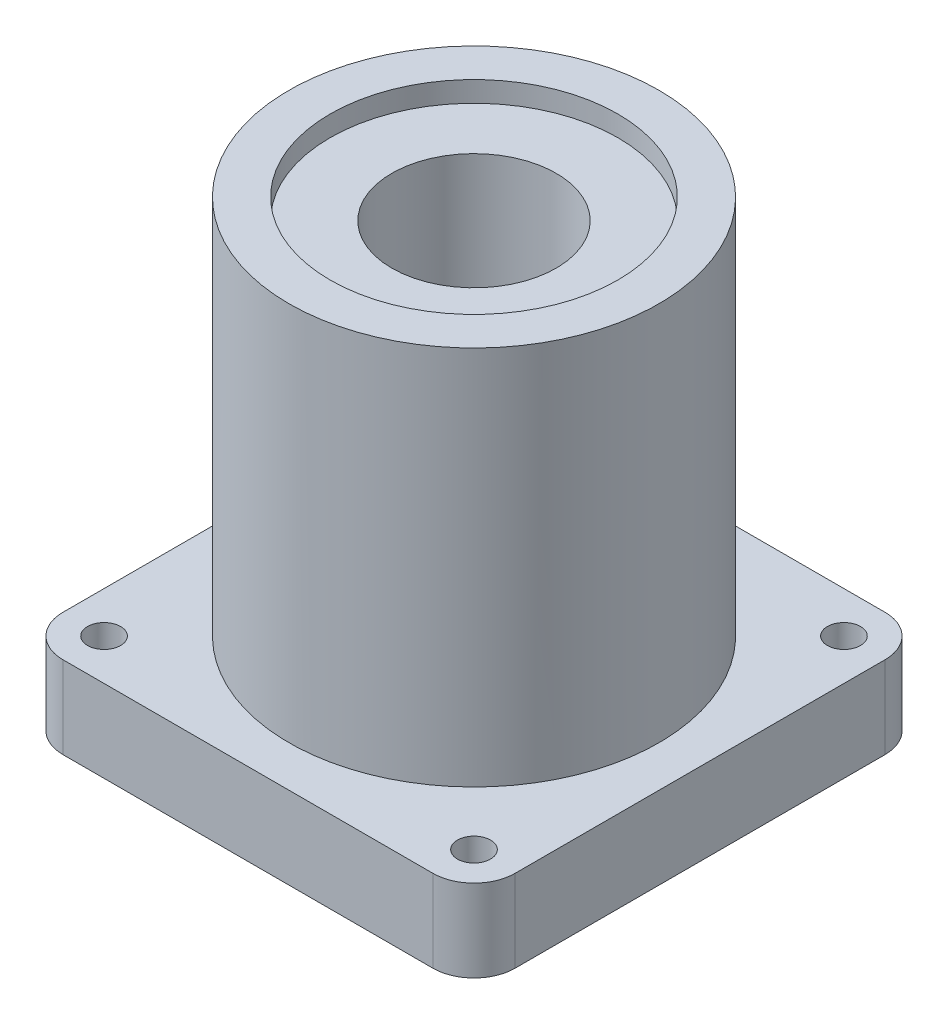
ISO-10303-21;
HEADER;
FILE_DESCRIPTION(('STEP AP214'),'2;1');
FILE_NAME('part.step','',(''),(''),'','','');
FILE_SCHEMA(('AUTOMOTIVE_DESIGN { 1 0 10303 214 1 1 1 1 }'));
ENDSEC;
DATA;
#1=APPLICATION_CONTEXT('core data for automotive mechanical design processes');
#2=APPLICATION_PROTOCOL_DEFINITION('international standard','automotive_design',2000,#1);
#3=PRODUCT_CONTEXT('',#1,'mechanical');
#4=PRODUCT('Part','Part','',(#3));
#5=PRODUCT_RELATED_PRODUCT_CATEGORY('part','',(#4));
#6=PRODUCT_DEFINITION_FORMATION('','',#4);
#7=PRODUCT_DEFINITION_CONTEXT('part definition',#1,'design');
#8=PRODUCT_DEFINITION('design','',#6,#7);
#9=PRODUCT_DEFINITION_SHAPE('','',#8);
#10=(LENGTH_UNIT() NAMED_UNIT(*) SI_UNIT(.MILLI.,.METRE.));
#11=(NAMED_UNIT(*) PLANE_ANGLE_UNIT() SI_UNIT($,.RADIAN.));
#12=(NAMED_UNIT(*) SI_UNIT($,.STERADIAN.) SOLID_ANGLE_UNIT());
#13=UNCERTAINTY_MEASURE_WITH_UNIT(LENGTH_MEASURE(1.E-05),#10,'distance_accuracy_value','');
#14=(GEOMETRIC_REPRESENTATION_CONTEXT(3) GLOBAL_UNCERTAINTY_ASSIGNED_CONTEXT((#13)) GLOBAL_UNIT_ASSIGNED_CONTEXT((#10,
#11,#12)) REPRESENTATION_CONTEXT('',''));
#15=CARTESIAN_POINT('',(0.,0.,0.));
#16=DIRECTION('',(0.,0.,1.));
#17=DIRECTION('',(1.,0.,0.));
#18=AXIS2_PLACEMENT_3D('',#15,#16,#17);
#19=CARTESIAN_POINT('',(-34.925,12.7,34.925));
#20=DIRECTION('',(0.,-1.,0.));
#21=DIRECTION('',(0.,0.,-1.));
#22=AXIS2_PLACEMENT_3D('',#19,#20,#21);
#23=PLANE('',#22);
#24=CARTESIAN_POINT('',(28.5750000000002,12.7,28.5749999999998));
#25=DIRECTION('',(0.,1.,0.));
#26=DIRECTION('',(0.,0.,1.));
#27=AXIS2_PLACEMENT_3D('',#24,#25,#26);
#28=CIRCLE('',#27,2.55269999999999);
#29=CARTESIAN_POINT('',(28.5750000000002,12.7,31.1276999999998));
#30=VERTEX_POINT('',#29);
#31=EDGE_CURVE('E259',#30,#30,#28,.T.);
#32=ORIENTED_EDGE('',*,*,#31,.F.);
#33=EDGE_LOOP('',(#32));
#34=FACE_BOUND('',#33,.T.);
#35=CARTESIAN_POINT('',(-28.5749999999999,12.7,28.5750000000001));
#36=DIRECTION('',(0.,1.,0.));
#37=DIRECTION('',(0.,0.,1.));
#38=AXIS2_PLACEMENT_3D('',#35,#36,#37);
#39=CIRCLE('',#38,2.55269999999999);
#40=CARTESIAN_POINT('',(-28.5749999999999,12.7,31.1277000000001));
#41=VERTEX_POINT('',#40);
#42=EDGE_CURVE('E255',#41,#41,#39,.T.);
#43=ORIENTED_EDGE('',*,*,#42,.F.);
#44=EDGE_LOOP('',(#43));
#45=FACE_BOUND('',#44,.T.);
#46=CARTESIAN_POINT('',(-28.575,12.7,-28.575));
#47=DIRECTION('',(0.,1.,0.));
#48=DIRECTION('',(0.,0.,1.));
#49=AXIS2_PLACEMENT_3D('',#46,#47,#48);
#50=CIRCLE('',#49,2.55269999999999);
#51=CARTESIAN_POINT('',(-28.575,12.7,-26.0223));
#52=VERTEX_POINT('',#51);
#53=EDGE_CURVE('E252',#52,#52,#50,.T.);
#54=ORIENTED_EDGE('',*,*,#53,.F.);
#55=EDGE_LOOP('',(#54));
#56=FACE_BOUND('',#55,.T.);
#57=DIRECTION('',(1.,0.,0.));
#58=VECTOR('',#57,1.);
#59=CARTESIAN_POINT('',(-34.925,12.7,34.925));
#60=LINE('',#59,#58);
#61=CARTESIAN_POINT('',(-28.575,12.7,34.925));
#62=VERTEX_POINT('',#61);
#63=CARTESIAN_POINT('',(28.575,12.7,34.925));
#64=VERTEX_POINT('',#63);
#65=EDGE_CURVE('E130',#62,#64,#60,.T.);
#66=ORIENTED_EDGE('',*,*,#65,.T.);
#67=CARTESIAN_POINT('',(28.575,12.7,28.575));
#68=DIRECTION('',(0.,-1.,0.));
#69=DIRECTION('',(0.,0.,-1.));
#70=AXIS2_PLACEMENT_3D('',#67,#68,#69);
#71=CIRCLE('',#70,6.35);
#72=CARTESIAN_POINT('',(34.925,12.7,28.575));
#73=VERTEX_POINT('',#72);
#74=EDGE_CURVE('E149',#64,#73,#71,.F.);
#75=ORIENTED_EDGE('',*,*,#74,.T.);
#76=DIRECTION('',(0.,0.,1.));
#77=VECTOR('',#76,1.);
#78=CARTESIAN_POINT('',(34.925,12.7,-34.925));
#79=LINE('',#78,#77);
#80=CARTESIAN_POINT('',(34.925,12.7,-28.575));
#81=VERTEX_POINT('',#80);
#82=EDGE_CURVE('E181',#81,#73,#79,.T.);
#83=ORIENTED_EDGE('',*,*,#82,.F.);
#84=CARTESIAN_POINT('',(28.575,12.7,-28.575));
#85=DIRECTION('',(0.,-1.,0.));
#86=DIRECTION('',(0.,0.,-1.));
#87=AXIS2_PLACEMENT_3D('',#84,#85,#86);
#88=CIRCLE('',#87,6.35);
#89=CARTESIAN_POINT('',(28.575,12.7,-34.925));
#90=VERTEX_POINT('',#89);
#91=EDGE_CURVE('E59',#81,#90,#88,.F.);
#92=ORIENTED_EDGE('',*,*,#91,.T.);
#93=DIRECTION('',(-1.,0.,0.));
#94=VECTOR('',#93,1.);
#95=CARTESIAN_POINT('',(34.925,12.7,-34.925));
#96=LINE('',#95,#94);
#97=CARTESIAN_POINT('',(-28.575,12.7,-34.925));
#98=VERTEX_POINT('',#97);
#99=EDGE_CURVE('E179',#90,#98,#96,.T.);
#100=ORIENTED_EDGE('',*,*,#99,.T.);
#101=CARTESIAN_POINT('',(-28.575,12.7,-28.575));
#102=DIRECTION('',(0.,-1.,0.));
#103=DIRECTION('',(0.,0.,-1.));
#104=AXIS2_PLACEMENT_3D('',#101,#102,#103);
#105=CIRCLE('',#104,6.35);
#106=CARTESIAN_POINT('',(-34.925,12.7,-28.575));
#107=VERTEX_POINT('',#106);
#108=EDGE_CURVE('E144',#98,#107,#105,.F.);
#109=ORIENTED_EDGE('',*,*,#108,.T.);
#110=DIRECTION('',(0.,0.,-1.));
#111=VECTOR('',#110,1.);
#112=CARTESIAN_POINT('',(-34.925,12.7,34.925));
#113=LINE('',#112,#111);
#114=CARTESIAN_POINT('',(-34.925,12.7,28.575));
#115=VERTEX_POINT('',#114);
#116=EDGE_CURVE('E164',#115,#107,#113,.T.);
#117=ORIENTED_EDGE('',*,*,#116,.F.);
#118=CARTESIAN_POINT('',(-28.575,12.7,28.575));
#119=DIRECTION('',(0.,-1.,0.));
#120=DIRECTION('',(0.,0.,-1.));
#121=AXIS2_PLACEMENT_3D('',#118,#119,#120);
#122=CIRCLE('',#121,6.35);
#123=EDGE_CURVE('E146',#115,#62,#122,.F.);
#124=ORIENTED_EDGE('',*,*,#123,.T.);
#125=EDGE_LOOP('',(#66,#75,#83,#92,#100,#109,#117,#124));
#126=FACE_BOUND('',#125,.T.);
#127=CARTESIAN_POINT('',(0.,12.7,0.));
#128=DIRECTION('',(0.,-1.,0.));
#129=DIRECTION('',(0.,0.,-1.));
#130=AXIS2_PLACEMENT_3D('',#127,#128,#129);
#131=CIRCLE('',#130,28.575);
#132=CARTESIAN_POINT('',(0.,12.7,-28.575));
#133=VERTEX_POINT('',#132);
#134=EDGE_CURVE('E125',#133,#133,#131,.F.);
#135=ORIENTED_EDGE('',*,*,#134,.F.);
#136=EDGE_LOOP('',(#135));
#137=FACE_BOUND('',#136,.T.);
#138=CARTESIAN_POINT('',(28.5749999999997,12.7,-28.5750000000003));
#139=DIRECTION('',(0.,1.,0.));
#140=DIRECTION('',(0.,0.,1.));
#141=AXIS2_PLACEMENT_3D('',#138,#139,#140);
#142=CIRCLE('',#141,2.55269999999999);
#143=CARTESIAN_POINT('',(28.5749999999997,12.7,-26.0223000000003));
#144=VERTEX_POINT('',#143);
#145=EDGE_CURVE('E263',#144,#144,#142,.T.);
#146=ORIENTED_EDGE('',*,*,#145,.F.);
#147=EDGE_LOOP('',(#146));
#148=FACE_BOUND('',#147,.T.);
#149=ADVANCED_FACE('F36',(#34,#45,#56,#126,#137,#148),#23,.F.);
#150=CARTESIAN_POINT('',(0.,0.,0.));
#151=DIRECTION('',(0.,1.,0.));
#152=DIRECTION('',(0.,0.,1.));
#153=AXIS2_PLACEMENT_3D('',#150,#151,#152);
#154=CYLINDRICAL_SURFACE('',#153,12.7);
#155=CARTESIAN_POINT('',(0.,0.,0.));
#156=DIRECTION('',(0.,1.,0.));
#157=DIRECTION('',(0.,0.,1.));
#158=AXIS2_PLACEMENT_3D('',#155,#156,#157);
#159=CIRCLE('',#158,12.7);
#160=CARTESIAN_POINT('',(0.,0.,12.7));
#161=VERTEX_POINT('',#160);
#162=EDGE_CURVE('E172',#161,#161,#159,.T.);
#163=ORIENTED_EDGE('',*,*,#162,.F.);
#164=EDGE_LOOP('',(#163));
#165=FACE_BOUND('',#164,.T.);
#166=CARTESIAN_POINT('',(0.,68.2625,0.));
#167=DIRECTION('',(0.,1.,0.));
#168=DIRECTION('',(0.,0.,1.));
#169=AXIS2_PLACEMENT_3D('',#166,#167,#168);
#170=CIRCLE('',#169,12.7);
#171=CARTESIAN_POINT('',(0.,68.2625,12.7));
#172=VERTEX_POINT('',#171);
#173=EDGE_CURVE('E133',#172,#172,#170,.F.);
#174=ORIENTED_EDGE('',*,*,#173,.F.);
#175=EDGE_LOOP('',(#174));
#176=FACE_BOUND('',#175,.T.);
#177=ADVANCED_FACE('F200',(#165,#176),#154,.F.);
#178=CARTESIAN_POINT('',(-34.925,12.7,34.925));
#179=DIRECTION('',(-1.,0.,0.));
#180=DIRECTION('',(0.,0.,1.));
#181=AXIS2_PLACEMENT_3D('',#178,#179,#180);
#182=PLANE('',#181);
#183=DIRECTION('',(0.,0.,-1.));
#184=VECTOR('',#183,1.);
#185=CARTESIAN_POINT('',(-34.925,0.,34.925));
#186=LINE('',#185,#184);
#187=CARTESIAN_POINT('',(-34.925,0.,28.575));
#188=VERTEX_POINT('',#187);
#189=CARTESIAN_POINT('',(-34.925,0.,-28.575));
#190=VERTEX_POINT('',#189);
#191=EDGE_CURVE('E161',#188,#190,#186,.T.);
#192=ORIENTED_EDGE('',*,*,#191,.F.);
#193=DIRECTION('',(0.,-1.,0.));
#194=VECTOR('',#193,1.);
#195=CARTESIAN_POINT('',(-34.925,12.7,28.575));
#196=LINE('',#195,#194);
#197=EDGE_CURVE('E11',#188,#115,#196,.F.);
#198=ORIENTED_EDGE('',*,*,#197,.T.);
#199=ORIENTED_EDGE('',*,*,#116,.T.);
#200=DIRECTION('',(0.,-1.,0.));
#201=VECTOR('',#200,1.);
#202=CARTESIAN_POINT('',(-34.925,0.,-28.575));
#203=LINE('',#202,#201);
#204=EDGE_CURVE('E45',#107,#190,#203,.T.);
#205=ORIENTED_EDGE('',*,*,#204,.T.);
#206=EDGE_LOOP('',(#192,#198,#199,#205));
#207=FACE_BOUND('',#206,.T.);
#208=ADVANCED_FACE('F160',(#207),#182,.T.);
#209=CARTESIAN_POINT('',(-34.925,12.7,34.925));
#210=DIRECTION('',(0.,0.,-1.));
#211=DIRECTION('',(-1.,0.,0.));
#212=AXIS2_PLACEMENT_3D('',#209,#210,#211);
#213=PLANE('',#212);
#214=DIRECTION('',(1.,0.,0.));
#215=VECTOR('',#214,1.);
#216=CARTESIAN_POINT('',(-34.925,0.,34.925));
#217=LINE('',#216,#215);
#218=CARTESIAN_POINT('',(-28.575,0.,34.925));
#219=VERTEX_POINT('',#218);
#220=CARTESIAN_POINT('',(28.575,0.,34.925));
#221=VERTEX_POINT('',#220);
#222=EDGE_CURVE('E122',#219,#221,#217,.T.);
#223=ORIENTED_EDGE('',*,*,#222,.T.);
#224=DIRECTION('',(0.,-1.,0.));
#225=VECTOR('',#224,1.);
#226=CARTESIAN_POINT('',(28.575,12.7,34.925));
#227=LINE('',#226,#225);
#228=EDGE_CURVE('E142',#221,#64,#227,.F.);
#229=ORIENTED_EDGE('',*,*,#228,.T.);
#230=ORIENTED_EDGE('',*,*,#65,.F.);
#231=DIRECTION('',(0.,-1.,0.));
#232=VECTOR('',#231,1.);
#233=CARTESIAN_POINT('',(-28.575,0.,34.925));
#234=LINE('',#233,#232);
#235=EDGE_CURVE('E139',#62,#219,#234,.T.);
#236=ORIENTED_EDGE('',*,*,#235,.T.);
#237=EDGE_LOOP('',(#223,#229,#230,#236));
#238=FACE_BOUND('',#237,.T.);
#239=ADVANCED_FACE('F191',(#238),#213,.F.);
#240=CARTESIAN_POINT('',(34.925,12.7,-34.925));
#241=DIRECTION('',(1.,0.,0.));
#242=DIRECTION('',(0.,0.,-1.));
#243=AXIS2_PLACEMENT_3D('',#240,#241,#242);
#244=PLANE('',#243);
#245=ORIENTED_EDGE('',*,*,#82,.T.);
#246=DIRECTION('',(0.,-1.,0.));
#247=VECTOR('',#246,1.);
#248=CARTESIAN_POINT('',(34.925,0.,28.575));
#249=LINE('',#248,#247);
#250=CARTESIAN_POINT('',(34.925,0.,28.575));
#251=VERTEX_POINT('',#250);
#252=EDGE_CURVE('E121',#73,#251,#249,.T.);
#253=ORIENTED_EDGE('',*,*,#252,.T.);
#254=DIRECTION('',(0.,0.,1.));
#255=VECTOR('',#254,1.);
#256=CARTESIAN_POINT('',(34.925,0.,-34.925));
#257=LINE('',#256,#255);
#258=CARTESIAN_POINT('',(34.925,0.,-28.575));
#259=VERTEX_POINT('',#258);
#260=EDGE_CURVE('E106',#259,#251,#257,.T.);
#261=ORIENTED_EDGE('',*,*,#260,.F.);
#262=DIRECTION('',(0.,-1.,0.));
#263=VECTOR('',#262,1.);
#264=CARTESIAN_POINT('',(34.925,12.7,-28.575));
#265=LINE('',#264,#263);
#266=EDGE_CURVE('E119',#259,#81,#265,.F.);
#267=ORIENTED_EDGE('',*,*,#266,.T.);
#268=EDGE_LOOP('',(#245,#253,#261,#267));
#269=FACE_BOUND('',#268,.T.);
#270=ADVANCED_FACE('F118',(#269),#244,.T.);
#271=CARTESIAN_POINT('',(34.925,12.7,-34.925));
#272=DIRECTION('',(0.,0.,1.));
#273=DIRECTION('',(1.,0.,0.));
#274=AXIS2_PLACEMENT_3D('',#271,#272,#273);
#275=PLANE('',#274);
#276=ORIENTED_EDGE('',*,*,#99,.F.);
#277=DIRECTION('',(0.,-1.,0.));
#278=VECTOR('',#277,1.);
#279=CARTESIAN_POINT('',(28.575,0.,-34.925));
#280=LINE('',#279,#278);
#281=CARTESIAN_POINT('',(28.575,0.,-34.925));
#282=VERTEX_POINT('',#281);
#283=EDGE_CURVE('E152',#90,#282,#280,.T.);
#284=ORIENTED_EDGE('',*,*,#283,.T.);
#285=DIRECTION('',(-1.,0.,0.));
#286=VECTOR('',#285,1.);
#287=CARTESIAN_POINT('',(34.925,0.,-34.925));
#288=LINE('',#287,#286);
#289=CARTESIAN_POINT('',(-28.575,0.,-34.925));
#290=VERTEX_POINT('',#289);
#291=EDGE_CURVE('E107',#282,#290,#288,.T.);
#292=ORIENTED_EDGE('',*,*,#291,.T.);
#293=DIRECTION('',(0.,-1.,0.));
#294=VECTOR('',#293,1.);
#295=CARTESIAN_POINT('',(-28.575,12.7,-34.925));
#296=LINE('',#295,#294);
#297=EDGE_CURVE('E52',#290,#98,#296,.F.);
#298=ORIENTED_EDGE('',*,*,#297,.T.);
#299=EDGE_LOOP('',(#276,#284,#292,#298));
#300=FACE_BOUND('',#299,.T.);
#301=ADVANCED_FACE('F198',(#300),#275,.F.);
#302=CARTESIAN_POINT('',(-34.925,0.,34.925));
#303=DIRECTION('',(0.,-1.,0.));
#304=DIRECTION('',(0.,0.,-1.));
#305=AXIS2_PLACEMENT_3D('',#302,#303,#304);
#306=PLANE('',#305);
#307=CARTESIAN_POINT('',(28.5749999999997,0.,-28.5750000000003));
#308=DIRECTION('',(0.,-1.,0.));
#309=DIRECTION('',(0.,0.,-1.));
#310=AXIS2_PLACEMENT_3D('',#307,#308,#309);
#311=CIRCLE('',#310,2.55269999999999);
#312=CARTESIAN_POINT('',(28.5749999999997,0.,-31.1277000000003));
#313=VERTEX_POINT('',#312);
#314=EDGE_CURVE('E228',#313,#313,#311,.T.);
#315=ORIENTED_EDGE('',*,*,#314,.F.);
#316=EDGE_LOOP('',(#315));
#317=FACE_BOUND('',#316,.T.);
#318=CARTESIAN_POINT('',(28.5750000000002,0.,28.5749999999998));
#319=DIRECTION('',(0.,-1.,0.));
#320=DIRECTION('',(0.,0.,-1.));
#321=AXIS2_PLACEMENT_3D('',#318,#319,#320);
#322=CIRCLE('',#321,2.55269999999999);
#323=CARTESIAN_POINT('',(28.5750000000002,0.,26.0222999999998));
#324=VERTEX_POINT('',#323);
#325=EDGE_CURVE('E232',#324,#324,#322,.T.);
#326=ORIENTED_EDGE('',*,*,#325,.F.);
#327=EDGE_LOOP('',(#326));
#328=FACE_BOUND('',#327,.T.);
#329=CARTESIAN_POINT('',(-28.5749999999999,0.,28.5750000000001));
#330=DIRECTION('',(0.,-1.,0.));
#331=DIRECTION('',(0.,0.,-1.));
#332=AXIS2_PLACEMENT_3D('',#329,#330,#331);
#333=CIRCLE('',#332,2.55269999999999);
#334=CARTESIAN_POINT('',(-28.5749999999999,0.,26.0223000000001));
#335=VERTEX_POINT('',#334);
#336=EDGE_CURVE('E40',#335,#335,#333,.T.);
#337=ORIENTED_EDGE('',*,*,#336,.F.);
#338=EDGE_LOOP('',(#337));
#339=FACE_BOUND('',#338,.T.);
#340=CARTESIAN_POINT('',(-28.575,0.,-28.575));
#341=DIRECTION('',(0.,-1.,0.));
#342=DIRECTION('',(0.,0.,-1.));
#343=AXIS2_PLACEMENT_3D('',#340,#341,#342);
#344=CIRCLE('',#343,2.55269999999999);
#345=CARTESIAN_POINT('',(-28.575,0.,-31.1277));
#346=VERTEX_POINT('',#345);
#347=EDGE_CURVE('E239',#346,#346,#344,.T.);
#348=ORIENTED_EDGE('',*,*,#347,.F.);
#349=EDGE_LOOP('',(#348));
#350=FACE_BOUND('',#349,.T.);
#351=ORIENTED_EDGE('',*,*,#162,.T.);
#352=EDGE_LOOP('',(#351));
#353=FACE_BOUND('',#352,.T.);
#354=ORIENTED_EDGE('',*,*,#260,.T.);
#355=CARTESIAN_POINT('',(28.575,0.,28.575));
#356=DIRECTION('',(0.,-1.,0.));
#357=DIRECTION('',(0.,0.,-1.));
#358=AXIS2_PLACEMENT_3D('',#355,#356,#357);
#359=CIRCLE('',#358,6.35);
#360=EDGE_CURVE('E112',#251,#221,#359,.T.);
#361=ORIENTED_EDGE('',*,*,#360,.T.);
#362=ORIENTED_EDGE('',*,*,#222,.F.);
#363=CARTESIAN_POINT('',(-28.575,0.,28.575));
#364=DIRECTION('',(0.,-1.,0.));
#365=DIRECTION('',(0.,0.,-1.));
#366=AXIS2_PLACEMENT_3D('',#363,#364,#365);
#367=CIRCLE('',#366,6.35);
#368=EDGE_CURVE('E113',#219,#188,#367,.T.);
#369=ORIENTED_EDGE('',*,*,#368,.T.);
#370=ORIENTED_EDGE('',*,*,#191,.T.);
#371=CARTESIAN_POINT('',(-28.575,0.,-28.575));
#372=DIRECTION('',(0.,-1.,0.));
#373=DIRECTION('',(0.,0.,-1.));
#374=AXIS2_PLACEMENT_3D('',#371,#372,#373);
#375=CIRCLE('',#374,6.35);
#376=EDGE_CURVE('E127',#190,#290,#375,.T.);
#377=ORIENTED_EDGE('',*,*,#376,.T.);
#378=ORIENTED_EDGE('',*,*,#291,.F.);
#379=CARTESIAN_POINT('',(28.575,0.,-28.575));
#380=DIRECTION('',(0.,-1.,0.));
#381=DIRECTION('',(0.,0.,-1.));
#382=AXIS2_PLACEMENT_3D('',#379,#380,#381);
#383=CIRCLE('',#382,6.35);
#384=EDGE_CURVE('E103',#282,#259,#383,.T.);
#385=ORIENTED_EDGE('',*,*,#384,.T.);
#386=EDGE_LOOP('',(#354,#361,#362,#369,#370,#377,#378,#385));
#387=FACE_BOUND('',#386,.T.);
#388=ADVANCED_FACE('F105',(#317,#328,#339,#350,#353,#387),#306,.T.);
#389=CARTESIAN_POINT('',(0.,71.4375,0.));
#390=DIRECTION('',(0.,-1.,0.));
#391=DIRECTION('',(0.,0.,-1.));
#392=AXIS2_PLACEMENT_3D('',#389,#390,#391);
#393=CYLINDRICAL_SURFACE('',#392,28.575);
#394=CARTESIAN_POINT('',(0.,71.4375,0.));
#395=DIRECTION('',(0.,1.,0.));
#396=DIRECTION('',(0.,0.,1.));
#397=AXIS2_PLACEMENT_3D('',#394,#395,#396);
#398=CIRCLE('',#397,28.575);
#399=CARTESIAN_POINT('',(0.,71.4375,28.575));
#400=VERTEX_POINT('',#399);
#401=EDGE_CURVE('E168',#400,#400,#398,.T.);
#402=ORIENTED_EDGE('',*,*,#401,.F.);
#403=EDGE_LOOP('',(#402));
#404=FACE_BOUND('',#403,.T.);
#405=ORIENTED_EDGE('',*,*,#134,.T.);
#406=EDGE_LOOP('',(#405));
#407=FACE_BOUND('',#406,.T.);
#408=ADVANCED_FACE('F214',(#404,#407),#393,.T.);
#409=CARTESIAN_POINT('',(0.,71.4375,0.));
#410=DIRECTION('',(0.,1.,0.));
#411=DIRECTION('',(0.,0.,1.));
#412=AXIS2_PLACEMENT_3D('',#409,#410,#411);
#413=PLANE('',#412);
#414=CARTESIAN_POINT('',(0.,71.4375,0.));
#415=DIRECTION('',(0.,1.,0.));
#416=DIRECTION('',(0.,0.,1.));
#417=AXIS2_PLACEMENT_3D('',#414,#415,#416);
#418=CIRCLE('',#417,22.225);
#419=CARTESIAN_POINT('',(0.,71.4375,22.225));
#420=VERTEX_POINT('',#419);
#421=EDGE_CURVE('E246',#420,#420,#418,.T.);
#422=ORIENTED_EDGE('',*,*,#421,.F.);
#423=EDGE_LOOP('',(#422));
#424=FACE_BOUND('',#423,.T.);
#425=ORIENTED_EDGE('',*,*,#401,.T.);
#426=EDGE_LOOP('',(#425));
#427=FACE_BOUND('',#426,.T.);
#428=ADVANCED_FACE('F222',(#424,#427),#413,.T.);
#429=CARTESIAN_POINT('',(0.,68.2625,0.));
#430=DIRECTION('',(0.,1.,0.));
#431=DIRECTION('',(0.,0.,1.));
#432=AXIS2_PLACEMENT_3D('',#429,#430,#431);
#433=PLANE('',#432);
#434=CARTESIAN_POINT('',(0.,68.2625,0.));
#435=DIRECTION('',(0.,1.,0.));
#436=DIRECTION('',(0.,0.,1.));
#437=AXIS2_PLACEMENT_3D('',#434,#435,#436);
#438=CIRCLE('',#437,22.225);
#439=CARTESIAN_POINT('',(0.,68.2625,22.225));
#440=VERTEX_POINT('',#439);
#441=EDGE_CURVE('E244',#440,#440,#438,.T.);
#442=ORIENTED_EDGE('',*,*,#441,.T.);
#443=EDGE_LOOP('',(#442));
#444=FACE_BOUND('',#443,.T.);
#445=ORIENTED_EDGE('',*,*,#173,.T.);
#446=EDGE_LOOP('',(#445));
#447=FACE_BOUND('',#446,.T.);
#448=ADVANCED_FACE('F287',(#444,#447),#433,.T.);
#449=CARTESIAN_POINT('',(0.,68.2625,0.));
#450=DIRECTION('',(0.,1.,0.));
#451=DIRECTION('',(0.,0.,1.));
#452=AXIS2_PLACEMENT_3D('',#449,#450,#451);
#453=CYLINDRICAL_SURFACE('',#452,22.225);
#454=ORIENTED_EDGE('',*,*,#441,.F.);
#455=EDGE_LOOP('',(#454));
#456=FACE_BOUND('',#455,.T.);
#457=ORIENTED_EDGE('',*,*,#421,.T.);
#458=EDGE_LOOP('',(#457));
#459=FACE_BOUND('',#458,.T.);
#460=ADVANCED_FACE('F290',(#456,#459),#453,.F.);
#461=CARTESIAN_POINT('',(28.575,12.7,28.575));
#462=DIRECTION('',(0.,1.,0.));
#463=DIRECTION('',(0.,0.,1.));
#464=AXIS2_PLACEMENT_3D('',#461,#462,#463);
#465=CYLINDRICAL_SURFACE('',#464,6.35);
#466=ORIENTED_EDGE('',*,*,#74,.F.);
#467=ORIENTED_EDGE('',*,*,#228,.F.);
#468=ORIENTED_EDGE('',*,*,#360,.F.);
#469=ORIENTED_EDGE('',*,*,#252,.F.);
#470=EDGE_LOOP('',(#466,#467,#468,#469));
#471=FACE_BOUND('',#470,.T.);
#472=ADVANCED_FACE('F190',(#471),#465,.T.);
#473=CARTESIAN_POINT('',(28.575,12.7,-28.575));
#474=DIRECTION('',(0.,1.,0.));
#475=DIRECTION('',(0.,0.,1.));
#476=AXIS2_PLACEMENT_3D('',#473,#474,#475);
#477=CYLINDRICAL_SURFACE('',#476,6.35);
#478=ORIENTED_EDGE('',*,*,#91,.F.);
#479=ORIENTED_EDGE('',*,*,#266,.F.);
#480=ORIENTED_EDGE('',*,*,#384,.F.);
#481=ORIENTED_EDGE('',*,*,#283,.F.);
#482=EDGE_LOOP('',(#478,#479,#480,#481));
#483=FACE_BOUND('',#482,.T.);
#484=ADVANCED_FACE('F124',(#483),#477,.T.);
#485=CARTESIAN_POINT('',(-28.575,12.7,28.575));
#486=DIRECTION('',(0.,1.,0.));
#487=DIRECTION('',(0.,0.,1.));
#488=AXIS2_PLACEMENT_3D('',#485,#486,#487);
#489=CYLINDRICAL_SURFACE('',#488,6.35);
#490=ORIENTED_EDGE('',*,*,#123,.F.);
#491=ORIENTED_EDGE('',*,*,#197,.F.);
#492=ORIENTED_EDGE('',*,*,#368,.F.);
#493=ORIENTED_EDGE('',*,*,#235,.F.);
#494=EDGE_LOOP('',(#490,#491,#492,#493));
#495=FACE_BOUND('',#494,.T.);
#496=ADVANCED_FACE('F329',(#495),#489,.T.);
#497=CARTESIAN_POINT('',(-28.575,12.7,-28.575));
#498=DIRECTION('',(0.,1.,0.));
#499=DIRECTION('',(0.,0.,1.));
#500=AXIS2_PLACEMENT_3D('',#497,#498,#499);
#501=CYLINDRICAL_SURFACE('',#500,6.35);
#502=ORIENTED_EDGE('',*,*,#108,.F.);
#503=ORIENTED_EDGE('',*,*,#297,.F.);
#504=ORIENTED_EDGE('',*,*,#376,.F.);
#505=ORIENTED_EDGE('',*,*,#204,.F.);
#506=EDGE_LOOP('',(#502,#503,#504,#505));
#507=FACE_BOUND('',#506,.T.);
#508=ADVANCED_FACE('F38',(#507),#501,.T.);
#509=CARTESIAN_POINT('',(-28.575,12.7,-28.575));
#510=DIRECTION('',(0.,1.,0.));
#511=DIRECTION('',(0.,0.,1.));
#512=AXIS2_PLACEMENT_3D('',#509,#510,#511);
#513=CYLINDRICAL_SURFACE('',#512,2.55269999999999);
#514=ORIENTED_EDGE('',*,*,#347,.T.);
#515=EDGE_LOOP('',(#514));
#516=FACE_BOUND('',#515,.T.);
#517=ORIENTED_EDGE('',*,*,#53,.T.);
#518=EDGE_LOOP('',(#517));
#519=FACE_BOUND('',#518,.T.);
#520=ADVANCED_FACE('F282',(#516,#519),#513,.F.);
#521=CARTESIAN_POINT('',(-28.5749999999999,12.7,28.5750000000001));
#522=DIRECTION('',(0.,1.,0.));
#523=DIRECTION('',(0.,0.,1.));
#524=AXIS2_PLACEMENT_3D('',#521,#522,#523);
#525=CYLINDRICAL_SURFACE('',#524,2.55269999999999);
#526=ORIENTED_EDGE('',*,*,#336,.T.);
#527=EDGE_LOOP('',(#526));
#528=FACE_BOUND('',#527,.T.);
#529=ORIENTED_EDGE('',*,*,#42,.T.);
#530=EDGE_LOOP('',(#529));
#531=FACE_BOUND('',#530,.T.);
#532=ADVANCED_FACE('F276',(#528,#531),#525,.F.);
#533=CARTESIAN_POINT('',(28.5750000000002,12.7,28.5749999999998));
#534=DIRECTION('',(0.,1.,0.));
#535=DIRECTION('',(0.,0.,1.));
#536=AXIS2_PLACEMENT_3D('',#533,#534,#535);
#537=CYLINDRICAL_SURFACE('',#536,2.55269999999999);
#538=ORIENTED_EDGE('',*,*,#325,.T.);
#539=EDGE_LOOP('',(#538));
#540=FACE_BOUND('',#539,.T.);
#541=ORIENTED_EDGE('',*,*,#31,.T.);
#542=EDGE_LOOP('',(#541));
#543=FACE_BOUND('',#542,.T.);
#544=ADVANCED_FACE('F270',(#540,#543),#537,.F.);
#545=CARTESIAN_POINT('',(28.5749999999997,12.7,-28.5750000000003));
#546=DIRECTION('',(0.,1.,0.));
#547=DIRECTION('',(0.,0.,1.));
#548=AXIS2_PLACEMENT_3D('',#545,#546,#547);
#549=CYLINDRICAL_SURFACE('',#548,2.55269999999999);
#550=ORIENTED_EDGE('',*,*,#314,.T.);
#551=EDGE_LOOP('',(#550));
#552=FACE_BOUND('',#551,.T.);
#553=ORIENTED_EDGE('',*,*,#145,.T.);
#554=EDGE_LOOP('',(#553));
#555=FACE_BOUND('',#554,.T.);
#556=ADVANCED_FACE('F267',(#552,#555),#549,.F.);
#557=CLOSED_SHELL('',(#149,#177,#208,#239,#270,#301,#388,#408,#428,#448,#460,#472,#484,#496,
#508,#520,#532,#544,#556));
#558=MANIFOLD_SOLID_BREP('B2',#557);
#559=ADVANCED_BREP_SHAPE_REPRESENTATION('',(#18,#558),#14);
#560=SHAPE_DEFINITION_REPRESENTATION(#9,#559);
ENDSEC;
END-ISO-10303-21;
